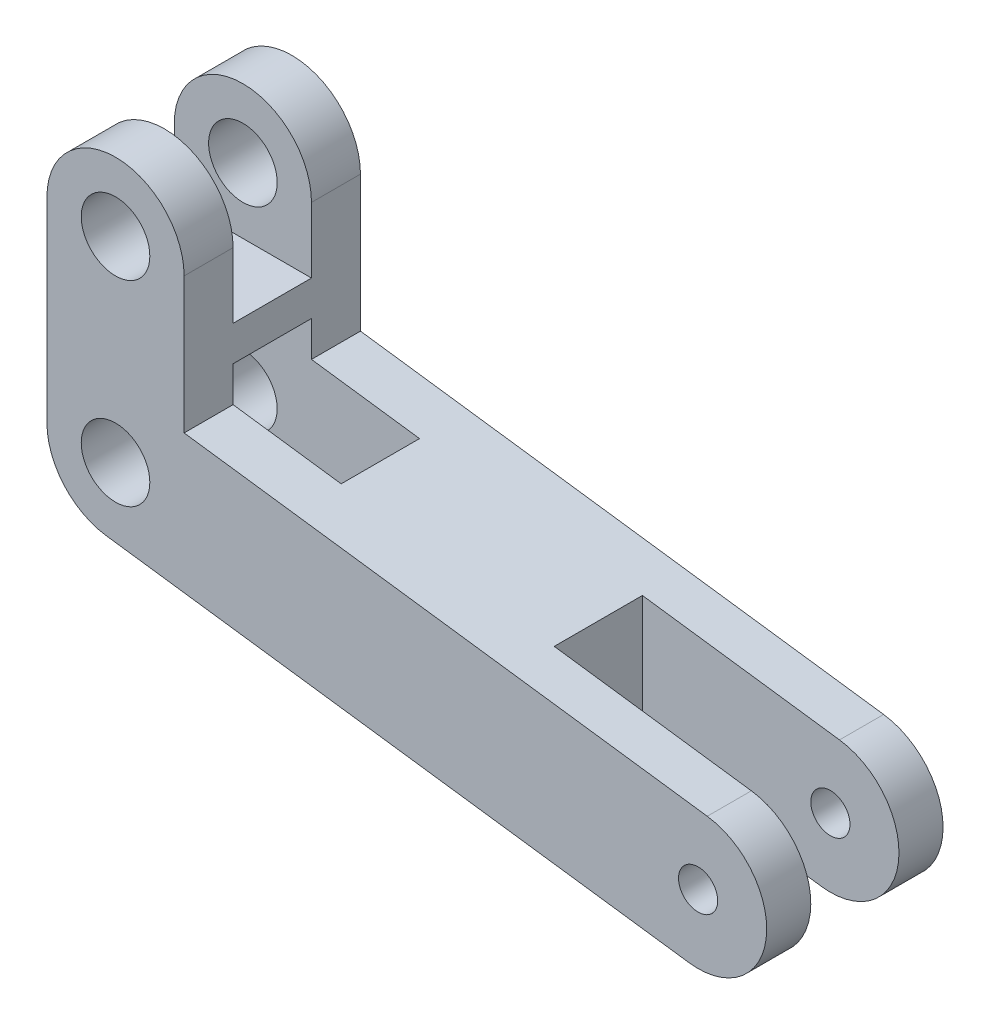
ISO-10303-21;
HEADER;
FILE_DESCRIPTION(('STEP AP214'),'2;1');
FILE_NAME('part.step','',(''),(''),'','','');
FILE_SCHEMA(('AUTOMOTIVE_DESIGN { 1 0 10303 214 1 1 1 1 }'));
ENDSEC;
DATA;
#1=APPLICATION_CONTEXT('core data for automotive mechanical design processes');
#2=APPLICATION_PROTOCOL_DEFINITION('international standard','automotive_design',2000,#1);
#3=PRODUCT_CONTEXT('',#1,'mechanical');
#4=PRODUCT('Part','Part','',(#3));
#5=PRODUCT_RELATED_PRODUCT_CATEGORY('part','',(#4));
#6=PRODUCT_DEFINITION_FORMATION('','',#4);
#7=PRODUCT_DEFINITION_CONTEXT('part definition',#1,'design');
#8=PRODUCT_DEFINITION('design','',#6,#7);
#9=PRODUCT_DEFINITION_SHAPE('','',#8);
#10=(LENGTH_UNIT() NAMED_UNIT(*) SI_UNIT(.MILLI.,.METRE.));
#11=(NAMED_UNIT(*) PLANE_ANGLE_UNIT() SI_UNIT($,.RADIAN.));
#12=(NAMED_UNIT(*) SI_UNIT($,.STERADIAN.) SOLID_ANGLE_UNIT());
#13=UNCERTAINTY_MEASURE_WITH_UNIT(LENGTH_MEASURE(1.E-05),#10,'distance_accuracy_value','');
#14=(GEOMETRIC_REPRESENTATION_CONTEXT(3) GLOBAL_UNCERTAINTY_ASSIGNED_CONTEXT((#13)) GLOBAL_UNIT_ASSIGNED_CONTEXT((#10,
#11,#12)) REPRESENTATION_CONTEXT('',''));
#15=CARTESIAN_POINT('',(0.,0.,0.));
#16=DIRECTION('',(0.,0.,1.));
#17=DIRECTION('',(1.,0.,0.));
#18=AXIS2_PLACEMENT_3D('',#15,#16,#17);
#19=CARTESIAN_POINT('',(29.732137494637,-4.,4.5));
#20=DIRECTION('',(0.,0.,-1.));
#21=DIRECTION('',(-1.,0.,0.));
#22=AXIS2_PLACEMENT_3D('',#19,#20,#21);
#23=CYLINDRICAL_SURFACE('',#22,3.5);
#24=CARTESIAN_POINT('',(29.732137494637,-4.,-2.25));
#25=DIRECTION('',(0.,0.,1.));
#26=DIRECTION('',(1.,0.,0.));
#27=AXIS2_PLACEMENT_3D('',#24,#25,#26);
#28=CIRCLE('',#27,3.5);
#29=CARTESIAN_POINT('',(29.2654708279703,-7.46874937437432,-2.25));
#30=VERTEX_POINT('',#29);
#31=CARTESIAN_POINT('',(30.1988041613037,-0.53125062562568,-2.25));
#32=VERTEX_POINT('',#31);
#33=EDGE_CURVE('E219',#30,#32,#28,.T.);
#34=ORIENTED_EDGE('',*,*,#33,.F.);
#35=DIRECTION('',(0.,0.,-1.));
#36=VECTOR('',#35,1.);
#37=CARTESIAN_POINT('',(29.2654708279703,-7.46874937437432,4.5));
#38=LINE('',#37,#36);
#39=CARTESIAN_POINT('',(29.2654708279703,-7.46874937437432,-4.5));
#40=VERTEX_POINT('',#39);
#41=EDGE_CURVE('E323',#30,#40,#38,.T.);
#42=ORIENTED_EDGE('',*,*,#41,.T.);
#43=CARTESIAN_POINT('',(29.732137494637,-4.,-4.5));
#44=DIRECTION('',(0.,0.,1.));
#45=DIRECTION('',(1.,0.,0.));
#46=AXIS2_PLACEMENT_3D('',#43,#44,#45);
#47=CIRCLE('',#46,3.5);
#48=CARTESIAN_POINT('',(30.1988041613037,-0.531250625625681,-4.5));
#49=VERTEX_POINT('',#48);
#50=EDGE_CURVE('E304',#40,#49,#47,.T.);
#51=ORIENTED_EDGE('',*,*,#50,.T.);
#52=DIRECTION('',(0.,0.,-1.));
#53=VECTOR('',#52,1.);
#54=CARTESIAN_POINT('',(30.1988041613037,-0.531250625625681,4.5));
#55=LINE('',#54,#53);
#56=EDGE_CURVE('E366',#32,#49,#55,.T.);
#57=ORIENTED_EDGE('',*,*,#56,.F.);
#58=EDGE_LOOP('',(#34,#42,#51,#57));
#59=FACE_BOUND('',#58,.T.);
#60=ADVANCED_FACE('F41',(#59),#23,.T.);
#61=CARTESIAN_POINT('',(30.1988041613037,-0.531250625625681,4.5));
#62=DIRECTION('',(-0.133333333333333,-0.991071249821234,0.));
#63=DIRECTION('',(0.991071249821234,-0.133333333333333,0.));
#64=AXIS2_PLACEMENT_3D('',#61,#62,#63);
#65=PLANE('',#64);
#66=DIRECTION('',(-0.991071249821234,0.133333333333333,0.));
#67=VECTOR('',#66,1.);
#68=CARTESIAN_POINT('',(30.1988041613037,-0.531250625625681,-2.25));
#69=LINE('',#68,#67);
#70=CARTESIAN_POINT('',(20.1387282375716,0.822177250260696,-2.25));
#71=VERTEX_POINT('',#70);
#72=EDGE_CURVE('E201',#32,#71,#69,.T.);
#73=ORIENTED_EDGE('',*,*,#72,.F.);
#74=ORIENTED_EDGE('',*,*,#56,.T.);
#75=DIRECTION('',(-0.991071249821234,0.133333333333333,0.));
#76=VECTOR('',#75,1.);
#77=CARTESIAN_POINT('',(30.1988041613037,-0.531250625625681,-4.5));
#78=LINE('',#77,#76);
#79=CARTESIAN_POINT('',(3.5,3.06066121268322,-4.5));
#80=VERTEX_POINT('',#79);
#81=EDGE_CURVE('E326',#49,#80,#78,.T.);
#82=ORIENTED_EDGE('',*,*,#81,.T.);
#83=DIRECTION('',(0.,0.,-1.));
#84=VECTOR('',#83,1.);
#85=CARTESIAN_POINT('',(3.5,3.06066121268322,4.5));
#86=LINE('',#85,#84);
#87=CARTESIAN_POINT('',(3.5,3.06066121268322,-2.));
#88=VERTEX_POINT('',#87);
#89=EDGE_CURVE('E362',#88,#80,#86,.T.);
#90=ORIENTED_EDGE('',*,*,#89,.F.);
#91=DIRECTION('',(0.991071249821234,-0.133333333333333,0.));
#92=VECTOR('',#91,1.);
#93=CARTESIAN_POINT('',(30.1988041613037,-0.531250625625681,-2.));
#94=LINE('',#93,#92);
#95=CARTESIAN_POINT('',(9.01483292771079,2.31872559790201,-2.));
#96=VERTEX_POINT('',#95);
#97=EDGE_CURVE('E279',#88,#96,#94,.T.);
#98=ORIENTED_EDGE('',*,*,#97,.T.);
#99=DIRECTION('',(0.,0.,1.));
#100=VECTOR('',#99,1.);
#101=CARTESIAN_POINT('',(9.01483292771079,2.31872559790201,4.5));
#102=LINE('',#101,#100);
#103=CARTESIAN_POINT('',(9.01483292771079,2.31872559790201,2.));
#104=VERTEX_POINT('',#103);
#105=EDGE_CURVE('E282',#96,#104,#102,.T.);
#106=ORIENTED_EDGE('',*,*,#105,.T.);
#107=DIRECTION('',(0.991071249821234,-0.133333333333333,0.));
#108=VECTOR('',#107,1.);
#109=CARTESIAN_POINT('',(30.1988041613037,-0.531250625625681,2.));
#110=LINE('',#109,#108);
#111=CARTESIAN_POINT('',(3.5,3.06066121268322,2.));
#112=VERTEX_POINT('',#111);
#113=EDGE_CURVE('E264',#112,#104,#110,.T.);
#114=ORIENTED_EDGE('',*,*,#113,.F.);
#115=CARTESIAN_POINT('',(3.5,3.06066121268322,4.5));
#116=VERTEX_POINT('',#115);
#117=EDGE_CURVE('E363',#116,#112,#86,.T.);
#118=ORIENTED_EDGE('',*,*,#117,.F.);
#119=DIRECTION('',(-0.991071249821234,0.133333333333333,0.));
#120=VECTOR('',#119,1.);
#121=CARTESIAN_POINT('',(30.1988041613037,-0.531250625625681,4.5));
#122=LINE('',#121,#120);
#123=CARTESIAN_POINT('',(30.1988041613037,-0.531250625625681,4.5));
#124=VERTEX_POINT('',#123);
#125=EDGE_CURVE('E310',#124,#116,#122,.T.);
#126=ORIENTED_EDGE('',*,*,#125,.F.);
#127=CARTESIAN_POINT('',(30.1988041613037,-0.53125062562568,2.25));
#128=VERTEX_POINT('',#127);
#129=EDGE_CURVE('E210',#124,#128,#55,.T.);
#130=ORIENTED_EDGE('',*,*,#129,.T.);
#131=DIRECTION('',(-0.991071249821234,0.133333333333333,0.));
#132=VECTOR('',#131,1.);
#133=CARTESIAN_POINT('',(30.1988041613037,-0.531250625625681,2.25));
#134=LINE('',#133,#132);
#135=CARTESIAN_POINT('',(20.1387282375716,0.822177250260696,2.25));
#136=VERTEX_POINT('',#135);
#137=EDGE_CURVE('E204',#128,#136,#134,.T.);
#138=ORIENTED_EDGE('',*,*,#137,.T.);
#139=DIRECTION('',(0.,0.,-1.));
#140=VECTOR('',#139,1.);
#141=CARTESIAN_POINT('',(20.1387282375716,0.822177250260698,4.5));
#142=LINE('',#141,#140);
#143=EDGE_CURVE('E191',#136,#71,#142,.T.);
#144=ORIENTED_EDGE('',*,*,#143,.T.);
#145=EDGE_LOOP('',(#73,#74,#82,#90,#98,#106,#114,#118,#126,#130,#138,#144));
#146=FACE_BOUND('',#145,.T.);
#147=ADVANCED_FACE('F208',(#146),#65,.F.);
#148=CARTESIAN_POINT('',(29.2654708279703,-7.46874937437432,4.5));
#149=DIRECTION('',(0.133333333333333,0.991071249821234,0.));
#150=DIRECTION('',(-0.991071249821234,0.133333333333333,0.));
#151=AXIS2_PLACEMENT_3D('',#148,#149,#150);
#152=PLANE('',#151);
#153=DIRECTION('',(0.991071249821234,-0.133333333333333,0.));
#154=VECTOR('',#153,1.);
#155=CARTESIAN_POINT('',(29.2654708279703,-7.46874937437432,-2.25));
#156=LINE('',#155,#154);
#157=CARTESIAN_POINT('',(20.1387282375716,-6.24088708670059,-2.25));
#158=VERTEX_POINT('',#157);
#159=EDGE_CURVE('E214',#158,#30,#156,.T.);
#160=ORIENTED_EDGE('',*,*,#159,.F.);
#161=DIRECTION('',(0.,0.,1.));
#162=VECTOR('',#161,1.);
#163=CARTESIAN_POINT('',(20.1387282375716,-6.24088708670059,4.5));
#164=LINE('',#163,#162);
#165=CARTESIAN_POINT('',(20.1387282375716,-6.24088708670059,2.25));
#166=VERTEX_POINT('',#165);
#167=EDGE_CURVE('E11',#158,#166,#164,.T.);
#168=ORIENTED_EDGE('',*,*,#167,.T.);
#169=DIRECTION('',(0.991071249821234,-0.133333333333333,0.));
#170=VECTOR('',#169,1.);
#171=CARTESIAN_POINT('',(29.2654708279703,-7.46874937437432,2.25));
#172=LINE('',#171,#170);
#173=CARTESIAN_POINT('',(29.2654708279703,-7.46874937437432,2.25));
#174=VERTEX_POINT('',#173);
#175=EDGE_CURVE('E205',#166,#174,#172,.T.);
#176=ORIENTED_EDGE('',*,*,#175,.T.);
#177=CARTESIAN_POINT('',(29.2654708279703,-7.46874937437432,4.5));
#178=VERTEX_POINT('',#177);
#179=EDGE_CURVE('E343',#178,#174,#38,.T.);
#180=ORIENTED_EDGE('',*,*,#179,.F.);
#181=DIRECTION('',(0.991071249821234,-0.133333333333333,0.));
#182=VECTOR('',#181,1.);
#183=CARTESIAN_POINT('',(29.2654708279703,-7.46874937437432,4.5));
#184=LINE('',#183,#182);
#185=CARTESIAN_POINT('',(-0.466666666666667,-3.46874937437432,4.5));
#186=VERTEX_POINT('',#185);
#187=EDGE_CURVE('E321',#186,#178,#184,.T.);
#188=ORIENTED_EDGE('',*,*,#187,.F.);
#189=DIRECTION('',(0.,0.,-1.));
#190=VECTOR('',#189,1.);
#191=CARTESIAN_POINT('',(-0.466666666666667,-3.46874937437432,4.5));
#192=LINE('',#191,#190);
#193=CARTESIAN_POINT('',(-0.466666666666664,-3.46874937437432,2.));
#194=VERTEX_POINT('',#193);
#195=EDGE_CURVE('E347',#186,#194,#192,.T.);
#196=ORIENTED_EDGE('',*,*,#195,.T.);
#197=DIRECTION('',(-0.991071249821234,0.133333333333333,0.));
#198=VECTOR('',#197,1.);
#199=CARTESIAN_POINT('',(29.2654708279703,-7.46874937437432,2.));
#200=LINE('',#199,#198);
#201=CARTESIAN_POINT('',(9.01483292771079,-4.74433873905928,2.));
#202=VERTEX_POINT('',#201);
#203=EDGE_CURVE('E256',#202,#194,#200,.T.);
#204=ORIENTED_EDGE('',*,*,#203,.F.);
#205=DIRECTION('',(0.,0.,-1.));
#206=VECTOR('',#205,1.);
#207=CARTESIAN_POINT('',(9.01483292771079,-4.74433873905928,4.5));
#208=LINE('',#207,#206);
#209=CARTESIAN_POINT('',(9.01483292771079,-4.74433873905928,-2.));
#210=VERTEX_POINT('',#209);
#211=EDGE_CURVE('E368',#202,#210,#208,.T.);
#212=ORIENTED_EDGE('',*,*,#211,.T.);
#213=DIRECTION('',(-0.991071249821234,0.133333333333333,0.));
#214=VECTOR('',#213,1.);
#215=CARTESIAN_POINT('',(29.2654708279703,-7.46874937437432,-2.));
#216=LINE('',#215,#214);
#217=CARTESIAN_POINT('',(-0.466666666666664,-3.46874937437432,-2.));
#218=VERTEX_POINT('',#217);
#219=EDGE_CURVE('E267',#210,#218,#216,.T.);
#220=ORIENTED_EDGE('',*,*,#219,.T.);
#221=CARTESIAN_POINT('',(-0.466666666666667,-3.46874937437432,-4.5));
#222=VERTEX_POINT('',#221);
#223=EDGE_CURVE('E346',#218,#222,#192,.T.);
#224=ORIENTED_EDGE('',*,*,#223,.T.);
#225=DIRECTION('',(0.991071249821234,-0.133333333333333,0.));
#226=VECTOR('',#225,1.);
#227=CARTESIAN_POINT('',(29.2654708279703,-7.46874937437432,-4.5));
#228=LINE('',#227,#226);
#229=EDGE_CURVE('E311',#222,#40,#228,.T.);
#230=ORIENTED_EDGE('',*,*,#229,.T.);
#231=ORIENTED_EDGE('',*,*,#41,.F.);
#232=EDGE_LOOP('',(#160,#168,#176,#180,#188,#196,#204,#212,#220,#224,#230,#231));
#233=FACE_BOUND('',#232,.T.);
#234=ADVANCED_FACE('F395',(#233),#152,.F.);
#235=CARTESIAN_POINT('',(29.732137494637,-4.,4.5));
#236=DIRECTION('',(0.,0.,-1.));
#237=DIRECTION('',(-1.,0.,0.));
#238=AXIS2_PLACEMENT_3D('',#235,#236,#237);
#239=CYLINDRICAL_SURFACE('',#238,0.999999999999998);
#240=CARTESIAN_POINT('',(29.732137494637,-4.,-4.5));
#241=DIRECTION('',(0.,0.,1.));
#242=DIRECTION('',(1.,0.,0.));
#243=AXIS2_PLACEMENT_3D('',#240,#241,#242);
#244=CIRCLE('',#243,0.999999999999998);
#245=CARTESIAN_POINT('',(30.732137494637,-4.,-4.5));
#246=VERTEX_POINT('',#245);
#247=EDGE_CURVE('E292',#246,#246,#244,.T.);
#248=ORIENTED_EDGE('',*,*,#247,.F.);
#249=EDGE_LOOP('',(#248));
#250=FACE_BOUND('',#249,.T.);
#251=CARTESIAN_POINT('',(29.732137494637,-4.,-2.25));
#252=DIRECTION('',(0.,0.,1.));
#253=DIRECTION('',(1.,0.,0.));
#254=AXIS2_PLACEMENT_3D('',#251,#252,#253);
#255=CIRCLE('',#254,0.999999999999998);
#256=CARTESIAN_POINT('',(30.732137494637,-4.,-2.25));
#257=VERTEX_POINT('',#256);
#258=EDGE_CURVE('E211',#257,#257,#255,.T.);
#259=ORIENTED_EDGE('',*,*,#258,.T.);
#260=EDGE_LOOP('',(#259));
#261=FACE_BOUND('',#260,.T.);
#262=ADVANCED_FACE('F470',(#250,#261),#239,.F.);
#263=CARTESIAN_POINT('',(3.5,10.,4.5));
#264=DIRECTION('',(-1.,0.,0.));
#265=DIRECTION('',(0.,-1.,0.));
#266=AXIS2_PLACEMENT_3D('',#263,#264,#265);
#267=PLANE('',#266);
#268=DIRECTION('',(0.,1.,0.));
#269=VECTOR('',#268,1.);
#270=CARTESIAN_POINT('',(3.5,16.4698635435501,-2.));
#271=LINE('',#270,#269);
#272=CARTESIAN_POINT('',(3.5,6.65669603838257,-2.));
#273=VERTEX_POINT('',#272);
#274=CARTESIAN_POINT('',(3.5,10.,-2.));
#275=VERTEX_POINT('',#274);
#276=EDGE_CURVE('E224',#273,#275,#271,.T.);
#277=ORIENTED_EDGE('',*,*,#276,.F.);
#278=DIRECTION('',(0.,0.,1.));
#279=VECTOR('',#278,1.);
#280=CARTESIAN_POINT('',(3.5,6.65669603838257,-2.));
#281=LINE('',#280,#279);
#282=CARTESIAN_POINT('',(3.5,6.65669603838257,2.));
#283=VERTEX_POINT('',#282);
#284=EDGE_CURVE('E227',#273,#283,#281,.T.);
#285=ORIENTED_EDGE('',*,*,#284,.T.);
#286=DIRECTION('',(0.,1.,0.));
#287=VECTOR('',#286,1.);
#288=CARTESIAN_POINT('',(3.5,16.4698635435501,2.));
#289=LINE('',#288,#287);
#290=CARTESIAN_POINT('',(3.5,10.,2.));
#291=VERTEX_POINT('',#290);
#292=EDGE_CURVE('E225',#283,#291,#289,.T.);
#293=ORIENTED_EDGE('',*,*,#292,.T.);
#294=DIRECTION('',(0.,0.,-1.));
#295=VECTOR('',#294,1.);
#296=CARTESIAN_POINT('',(3.5,10.,4.5));
#297=LINE('',#296,#295);
#298=CARTESIAN_POINT('',(3.5,10.,4.5));
#299=VERTEX_POINT('',#298);
#300=EDGE_CURVE('E359',#299,#291,#297,.T.);
#301=ORIENTED_EDGE('',*,*,#300,.F.);
#302=DIRECTION('',(0.,1.,0.));
#303=VECTOR('',#302,1.);
#304=CARTESIAN_POINT('',(3.5,10.,4.5));
#305=LINE('',#304,#303);
#306=EDGE_CURVE('E313',#116,#299,#305,.T.);
#307=ORIENTED_EDGE('',*,*,#306,.F.);
#308=ORIENTED_EDGE('',*,*,#117,.T.);
#309=DIRECTION('',(0.,-1.,0.));
#310=VECTOR('',#309,1.);
#311=CARTESIAN_POINT('',(3.5,10.,2.));
#312=LINE('',#311,#310);
#313=CARTESIAN_POINT('',(3.5,4.86934920884361,2.));
#314=VERTEX_POINT('',#313);
#315=EDGE_CURVE('E262',#314,#112,#312,.T.);
#316=ORIENTED_EDGE('',*,*,#315,.F.);
#317=DIRECTION('',(0.,0.,-1.));
#318=VECTOR('',#317,1.);
#319=CARTESIAN_POINT('',(3.5,4.86934920884361,4.5));
#320=LINE('',#319,#318);
#321=CARTESIAN_POINT('',(3.5,4.86934920884361,-2.));
#322=VERTEX_POINT('',#321);
#323=EDGE_CURVE('E285',#314,#322,#320,.T.);
#324=ORIENTED_EDGE('',*,*,#323,.T.);
#325=DIRECTION('',(0.,-1.,0.));
#326=VECTOR('',#325,1.);
#327=CARTESIAN_POINT('',(3.5,10.,-2.));
#328=LINE('',#327,#326);
#329=EDGE_CURVE('E276',#322,#88,#328,.T.);
#330=ORIENTED_EDGE('',*,*,#329,.T.);
#331=ORIENTED_EDGE('',*,*,#89,.T.);
#332=DIRECTION('',(0.,1.,0.));
#333=VECTOR('',#332,1.);
#334=CARTESIAN_POINT('',(3.5,10.,-4.5));
#335=LINE('',#334,#333);
#336=CARTESIAN_POINT('',(3.5,10.,-4.5));
#337=VERTEX_POINT('',#336);
#338=EDGE_CURVE('E329',#80,#337,#335,.T.);
#339=ORIENTED_EDGE('',*,*,#338,.T.);
#340=EDGE_CURVE('E358',#275,#337,#297,.T.);
#341=ORIENTED_EDGE('',*,*,#340,.F.);
#342=EDGE_LOOP('',(#277,#285,#293,#301,#307,#308,#316,#324,#330,#331,#339,#341));
#343=FACE_BOUND('',#342,.T.);
#344=ADVANCED_FACE('F411',(#343),#267,.F.);
#345=CARTESIAN_POINT('',(0.,10.,4.5));
#346=DIRECTION('',(0.,0.,-1.));
#347=DIRECTION('',(-1.,0.,0.));
#348=AXIS2_PLACEMENT_3D('',#345,#346,#347);
#349=CYLINDRICAL_SURFACE('',#348,3.5);
#350=CARTESIAN_POINT('',(0.,10.,-2.));
#351=DIRECTION('',(0.,0.,1.));
#352=DIRECTION('',(1.,0.,0.));
#353=AXIS2_PLACEMENT_3D('',#350,#351,#352);
#354=CIRCLE('',#353,3.5);
#355=CARTESIAN_POINT('',(-3.5,10.,-2.));
#356=VERTEX_POINT('',#355);
#357=EDGE_CURVE('E253',#275,#356,#354,.T.);
#358=ORIENTED_EDGE('',*,*,#357,.F.);
#359=ORIENTED_EDGE('',*,*,#340,.T.);
#360=CARTESIAN_POINT('',(0.,10.,-4.5));
#361=DIRECTION('',(0.,0.,1.));
#362=DIRECTION('',(1.,0.,0.));
#363=AXIS2_PLACEMENT_3D('',#360,#361,#362);
#364=CIRCLE('',#363,3.5);
#365=CARTESIAN_POINT('',(-3.5,10.,-4.5));
#366=VERTEX_POINT('',#365);
#367=EDGE_CURVE('E332',#337,#366,#364,.T.);
#368=ORIENTED_EDGE('',*,*,#367,.T.);
#369=DIRECTION('',(0.,0.,-1.));
#370=VECTOR('',#369,1.);
#371=CARTESIAN_POINT('',(-3.5,10.,4.5));
#372=LINE('',#371,#370);
#373=EDGE_CURVE('E354',#356,#366,#372,.T.);
#374=ORIENTED_EDGE('',*,*,#373,.F.);
#375=EDGE_LOOP('',(#358,#359,#368,#374));
#376=FACE_BOUND('',#375,.T.);
#377=ADVANCED_FACE('F459',(#376),#349,.T.);
#378=CARTESIAN_POINT('',(-3.5,10.,4.5));
#379=DIRECTION('',(1.,0.,0.));
#380=DIRECTION('',(0.,1.,0.));
#381=AXIS2_PLACEMENT_3D('',#378,#379,#380);
#382=PLANE('',#381);
#383=DIRECTION('',(0.,-1.,0.));
#384=VECTOR('',#383,1.);
#385=CARTESIAN_POINT('',(-3.5,10.,-2.));
#386=LINE('',#385,#384);
#387=CARTESIAN_POINT('',(-3.5,6.65669603838257,-2.));
#388=VERTEX_POINT('',#387);
#389=EDGE_CURVE('E251',#356,#388,#386,.T.);
#390=ORIENTED_EDGE('',*,*,#389,.F.);
#391=ORIENTED_EDGE('',*,*,#373,.T.);
#392=DIRECTION('',(0.,-1.,0.));
#393=VECTOR('',#392,1.);
#394=CARTESIAN_POINT('',(-3.5,10.,-4.5));
#395=LINE('',#394,#393);
#396=CARTESIAN_POINT('',(-3.5,0.,-4.5));
#397=VERTEX_POINT('',#396);
#398=EDGE_CURVE('E335',#366,#397,#395,.T.);
#399=ORIENTED_EDGE('',*,*,#398,.T.);
#400=DIRECTION('',(0.,0.,-1.));
#401=VECTOR('',#400,1.);
#402=CARTESIAN_POINT('',(-3.5,0.,4.5));
#403=LINE('',#402,#401);
#404=CARTESIAN_POINT('',(-3.5,0.,-2.));
#405=VERTEX_POINT('',#404);
#406=EDGE_CURVE('E350',#405,#397,#403,.T.);
#407=ORIENTED_EDGE('',*,*,#406,.F.);
#408=DIRECTION('',(0.,1.,0.));
#409=VECTOR('',#408,1.);
#410=CARTESIAN_POINT('',(-3.5,10.,-2.));
#411=LINE('',#410,#409);
#412=CARTESIAN_POINT('',(-3.5,4.86934920884361,-2.));
#413=VERTEX_POINT('',#412);
#414=EDGE_CURVE('E273',#405,#413,#411,.T.);
#415=ORIENTED_EDGE('',*,*,#414,.T.);
#416=DIRECTION('',(0.,0.,1.));
#417=VECTOR('',#416,1.);
#418=CARTESIAN_POINT('',(-3.5,4.86934920884361,4.5));
#419=LINE('',#418,#417);
#420=CARTESIAN_POINT('',(-3.5,4.86934920884361,2.));
#421=VERTEX_POINT('',#420);
#422=EDGE_CURVE('E379',#413,#421,#419,.T.);
#423=ORIENTED_EDGE('',*,*,#422,.T.);
#424=DIRECTION('',(0.,1.,0.));
#425=VECTOR('',#424,1.);
#426=CARTESIAN_POINT('',(-3.5,10.,2.));
#427=LINE('',#426,#425);
#428=CARTESIAN_POINT('',(-3.5,0.,2.));
#429=VERTEX_POINT('',#428);
#430=EDGE_CURVE('E260',#429,#421,#427,.T.);
#431=ORIENTED_EDGE('',*,*,#430,.F.);
#432=CARTESIAN_POINT('',(-3.5,0.,4.5));
#433=VERTEX_POINT('',#432);
#434=EDGE_CURVE('E351',#433,#429,#403,.T.);
#435=ORIENTED_EDGE('',*,*,#434,.F.);
#436=DIRECTION('',(0.,-1.,0.));
#437=VECTOR('',#436,1.);
#438=CARTESIAN_POINT('',(-3.5,10.,4.5));
#439=LINE('',#438,#437);
#440=CARTESIAN_POINT('',(-3.5,10.,4.5));
#441=VERTEX_POINT('',#440);
#442=EDGE_CURVE('E317',#441,#433,#439,.T.);
#443=ORIENTED_EDGE('',*,*,#442,.F.);
#444=CARTESIAN_POINT('',(-3.5,10.,2.));
#445=VERTEX_POINT('',#444);
#446=EDGE_CURVE('E355',#441,#445,#372,.T.);
#447=ORIENTED_EDGE('',*,*,#446,.T.);
#448=DIRECTION('',(0.,-1.,0.));
#449=VECTOR('',#448,1.);
#450=CARTESIAN_POINT('',(-3.5,10.,2.));
#451=LINE('',#450,#449);
#452=CARTESIAN_POINT('',(-3.5,6.65669603838257,2.));
#453=VERTEX_POINT('',#452);
#454=EDGE_CURVE('E244',#445,#453,#451,.T.);
#455=ORIENTED_EDGE('',*,*,#454,.T.);
#456=DIRECTION('',(0.,0.,-1.));
#457=VECTOR('',#456,1.);
#458=CARTESIAN_POINT('',(-3.5,6.65669603838257,4.5));
#459=LINE('',#458,#457);
#460=EDGE_CURVE('E49',#453,#388,#459,.T.);
#461=ORIENTED_EDGE('',*,*,#460,.T.);
#462=EDGE_LOOP('',(#390,#391,#399,#407,#415,#423,#431,#435,#443,#447,#455,#461));
#463=FACE_BOUND('',#462,.T.);
#464=ADVANCED_FACE('F434',(#463),#382,.F.);
#465=CARTESIAN_POINT('',(0.,0.,4.5));
#466=DIRECTION('',(0.,0.,-1.));
#467=DIRECTION('',(-1.,0.,0.));
#468=AXIS2_PLACEMENT_3D('',#465,#466,#467);
#469=CYLINDRICAL_SURFACE('',#468,3.5);
#470=CARTESIAN_POINT('',(0.,0.,2.));
#471=DIRECTION('',(0.,0.,-1.));
#472=DIRECTION('',(-1.,0.,0.));
#473=AXIS2_PLACEMENT_3D('',#470,#471,#472);
#474=CIRCLE('',#473,3.5);
#475=EDGE_CURVE('E258',#194,#429,#474,.T.);
#476=ORIENTED_EDGE('',*,*,#475,.F.);
#477=ORIENTED_EDGE('',*,*,#195,.F.);
#478=CARTESIAN_POINT('',(0.,0.,4.5));
#479=DIRECTION('',(0.,0.,1.));
#480=DIRECTION('',(1.,0.,0.));
#481=AXIS2_PLACEMENT_3D('',#478,#479,#480);
#482=CIRCLE('',#481,3.5);
#483=EDGE_CURVE('E319',#433,#186,#482,.T.);
#484=ORIENTED_EDGE('',*,*,#483,.F.);
#485=ORIENTED_EDGE('',*,*,#434,.T.);
#486=EDGE_LOOP('',(#476,#477,#484,#485));
#487=FACE_BOUND('',#486,.T.);
#488=ADVANCED_FACE('F428',(#487),#469,.T.);
#489=CARTESIAN_POINT('',(0.,0.,4.5));
#490=DIRECTION('',(0.,0.,-1.));
#491=DIRECTION('',(-1.,0.,0.));
#492=AXIS2_PLACEMENT_3D('',#489,#490,#491);
#493=CYLINDRICAL_SURFACE('',#492,1.75);
#494=CARTESIAN_POINT('',(0.,0.,4.5));
#495=DIRECTION('',(0.,0.,1.));
#496=DIRECTION('',(1.,0.,0.));
#497=AXIS2_PLACEMENT_3D('',#494,#495,#496);
#498=CIRCLE('',#497,1.75);
#499=CARTESIAN_POINT('',(1.75,0.,4.5));
#500=VERTEX_POINT('',#499);
#501=EDGE_CURVE('E301',#500,#500,#498,.T.);
#502=ORIENTED_EDGE('',*,*,#501,.T.);
#503=EDGE_LOOP('',(#502));
#504=FACE_BOUND('',#503,.T.);
#505=CARTESIAN_POINT('',(0.,0.,2.));
#506=DIRECTION('',(0.,0.,-1.));
#507=DIRECTION('',(-1.,0.,0.));
#508=AXIS2_PLACEMENT_3D('',#505,#506,#507);
#509=CIRCLE('',#508,1.75);
#510=CARTESIAN_POINT('',(-1.75,0.,2.));
#511=VERTEX_POINT('',#510);
#512=EDGE_CURVE('E255',#511,#511,#509,.T.);
#513=ORIENTED_EDGE('',*,*,#512,.T.);
#514=EDGE_LOOP('',(#513));
#515=FACE_BOUND('',#514,.T.);
#516=ADVANCED_FACE('F489',(#504,#515),#493,.F.);
#517=CARTESIAN_POINT('',(0.,10.,4.5));
#518=DIRECTION('',(0.,0.,-1.));
#519=DIRECTION('',(-1.,0.,0.));
#520=AXIS2_PLACEMENT_3D('',#517,#518,#519);
#521=CYLINDRICAL_SURFACE('',#520,1.75);
#522=CARTESIAN_POINT('',(0.,10.,-4.5));
#523=DIRECTION('',(0.,0.,1.));
#524=DIRECTION('',(1.,0.,0.));
#525=AXIS2_PLACEMENT_3D('',#522,#523,#524);
#526=CIRCLE('',#525,1.75);
#527=CARTESIAN_POINT('',(1.75,10.,-4.5));
#528=VERTEX_POINT('',#527);
#529=EDGE_CURVE('E288',#528,#528,#526,.T.);
#530=ORIENTED_EDGE('',*,*,#529,.F.);
#531=EDGE_LOOP('',(#530));
#532=FACE_BOUND('',#531,.T.);
#533=CARTESIAN_POINT('',(0.,10.,-2.));
#534=DIRECTION('',(0.,0.,1.));
#535=DIRECTION('',(1.,0.,0.));
#536=AXIS2_PLACEMENT_3D('',#533,#534,#535);
#537=CIRCLE('',#536,1.75);
#538=CARTESIAN_POINT('',(1.75,10.,-2.));
#539=VERTEX_POINT('',#538);
#540=EDGE_CURVE('E250',#539,#539,#537,.T.);
#541=ORIENTED_EDGE('',*,*,#540,.T.);
#542=EDGE_LOOP('',(#541));
#543=FACE_BOUND('',#542,.T.);
#544=ADVANCED_FACE('F483',(#532,#543),#521,.F.);
#545=CARTESIAN_POINT('',(29.732137494637,-4.,4.5));
#546=DIRECTION('',(0.,0.,1.));
#547=DIRECTION('',(1.,0.,0.));
#548=AXIS2_PLACEMENT_3D('',#545,#546,#547);
#549=PLANE('',#548);
#550=CARTESIAN_POINT('',(29.732137494637,-4.,4.5));
#551=DIRECTION('',(0.,0.,1.));
#552=DIRECTION('',(1.,0.,0.));
#553=AXIS2_PLACEMENT_3D('',#550,#551,#552);
#554=CIRCLE('',#553,0.999999999999998);
#555=CARTESIAN_POINT('',(30.732137494637,-4.,4.5));
#556=VERTEX_POINT('',#555);
#557=EDGE_CURVE('E295',#556,#556,#554,.T.);
#558=ORIENTED_EDGE('',*,*,#557,.F.);
#559=EDGE_LOOP('',(#558));
#560=FACE_BOUND('',#559,.T.);
#561=CARTESIAN_POINT('',(29.732137494637,-4.,4.5));
#562=DIRECTION('',(0.,0.,1.));
#563=DIRECTION('',(1.,0.,0.));
#564=AXIS2_PLACEMENT_3D('',#561,#562,#563);
#565=CIRCLE('',#564,3.5);
#566=EDGE_CURVE('E307',#178,#124,#565,.T.);
#567=ORIENTED_EDGE('',*,*,#566,.T.);
#568=ORIENTED_EDGE('',*,*,#125,.T.);
#569=ORIENTED_EDGE('',*,*,#306,.T.);
#570=CARTESIAN_POINT('',(0.,10.,4.5));
#571=DIRECTION('',(0.,0.,1.));
#572=DIRECTION('',(1.,0.,0.));
#573=AXIS2_PLACEMENT_3D('',#570,#571,#572);
#574=CIRCLE('',#573,3.5);
#575=EDGE_CURVE('E315',#299,#441,#574,.T.);
#576=ORIENTED_EDGE('',*,*,#575,.T.);
#577=ORIENTED_EDGE('',*,*,#442,.T.);
#578=ORIENTED_EDGE('',*,*,#483,.T.);
#579=ORIENTED_EDGE('',*,*,#187,.T.);
#580=EDGE_LOOP('',(#567,#568,#569,#576,#577,#578,#579));
#581=FACE_BOUND('',#580,.T.);
#582=ORIENTED_EDGE('',*,*,#501,.F.);
#583=EDGE_LOOP('',(#582));
#584=FACE_BOUND('',#583,.T.);
#585=CARTESIAN_POINT('',(0.,10.,4.5));
#586=DIRECTION('',(0.,0.,1.));
#587=DIRECTION('',(1.,0.,0.));
#588=AXIS2_PLACEMENT_3D('',#585,#586,#587);
#589=CIRCLE('',#588,1.75);
#590=CARTESIAN_POINT('',(1.75,10.,4.5));
#591=VERTEX_POINT('',#590);
#592=EDGE_CURVE('E289',#591,#591,#589,.T.);
#593=ORIENTED_EDGE('',*,*,#592,.F.);
#594=EDGE_LOOP('',(#593));
#595=FACE_BOUND('',#594,.T.);
#596=ADVANCED_FACE('F443',(#560,#581,#584,#595),#549,.T.);
#597=CARTESIAN_POINT('',(29.732137494637,-4.,-4.5));
#598=DIRECTION('',(0.,0.,1.));
#599=DIRECTION('',(1.,0.,0.));
#600=AXIS2_PLACEMENT_3D('',#597,#598,#599);
#601=PLANE('',#600);
#602=ORIENTED_EDGE('',*,*,#50,.F.);
#603=ORIENTED_EDGE('',*,*,#229,.F.);
#604=CARTESIAN_POINT('',(0.,0.,-4.5));
#605=DIRECTION('',(0.,0.,1.));
#606=DIRECTION('',(1.,0.,0.));
#607=AXIS2_PLACEMENT_3D('',#604,#605,#606);
#608=CIRCLE('',#607,3.5);
#609=EDGE_CURVE('E338',#397,#222,#608,.T.);
#610=ORIENTED_EDGE('',*,*,#609,.F.);
#611=ORIENTED_EDGE('',*,*,#398,.F.);
#612=ORIENTED_EDGE('',*,*,#367,.F.);
#613=ORIENTED_EDGE('',*,*,#338,.F.);
#614=ORIENTED_EDGE('',*,*,#81,.F.);
#615=EDGE_LOOP('',(#602,#603,#610,#611,#612,#613,#614));
#616=FACE_BOUND('',#615,.T.);
#617=CARTESIAN_POINT('',(0.,0.,-4.5));
#618=DIRECTION('',(0.,0.,1.));
#619=DIRECTION('',(1.,0.,0.));
#620=AXIS2_PLACEMENT_3D('',#617,#618,#619);
#621=CIRCLE('',#620,1.75);
#622=CARTESIAN_POINT('',(1.75,0.,-4.5));
#623=VERTEX_POINT('',#622);
#624=EDGE_CURVE('E298',#623,#623,#621,.T.);
#625=ORIENTED_EDGE('',*,*,#624,.T.);
#626=EDGE_LOOP('',(#625));
#627=FACE_BOUND('',#626,.T.);
#628=ORIENTED_EDGE('',*,*,#247,.T.);
#629=EDGE_LOOP('',(#628));
#630=FACE_BOUND('',#629,.T.);
#631=ORIENTED_EDGE('',*,*,#529,.T.);
#632=EDGE_LOOP('',(#631));
#633=FACE_BOUND('',#632,.T.);
#634=ADVANCED_FACE('F404',(#616,#627,#630,#633),#601,.F.);
#635=ORIENTED_EDGE('',*,*,#179,.T.);
#636=CARTESIAN_POINT('',(29.732137494637,-4.,2.25));
#637=DIRECTION('',(0.,0.,1.));
#638=DIRECTION('',(1.,0.,0.));
#639=AXIS2_PLACEMENT_3D('',#636,#637,#638);
#640=CIRCLE('',#639,3.5);
#641=EDGE_CURVE('E56',#174,#128,#640,.T.);
#642=ORIENTED_EDGE('',*,*,#641,.T.);
#643=ORIENTED_EDGE('',*,*,#129,.F.);
#644=ORIENTED_EDGE('',*,*,#566,.F.);
#645=EDGE_LOOP('',(#635,#642,#643,#644));
#646=FACE_BOUND('',#645,.T.);
#647=ADVANCED_FACE('F43',(#646),#23,.T.);
#648=ORIENTED_EDGE('',*,*,#300,.T.);
#649=CARTESIAN_POINT('',(0.,10.,2.));
#650=DIRECTION('',(0.,0.,1.));
#651=DIRECTION('',(1.,0.,0.));
#652=AXIS2_PLACEMENT_3D('',#649,#650,#651);
#653=CIRCLE('',#652,3.5);
#654=EDGE_CURVE('E247',#291,#445,#653,.T.);
#655=ORIENTED_EDGE('',*,*,#654,.T.);
#656=ORIENTED_EDGE('',*,*,#446,.F.);
#657=ORIENTED_EDGE('',*,*,#575,.F.);
#658=EDGE_LOOP('',(#648,#655,#656,#657));
#659=FACE_BOUND('',#658,.T.);
#660=ADVANCED_FACE('F450',(#659),#349,.T.);
#661=ORIENTED_EDGE('',*,*,#223,.F.);
#662=CARTESIAN_POINT('',(0.,0.,-2.));
#663=DIRECTION('',(0.,0.,-1.));
#664=DIRECTION('',(-1.,0.,0.));
#665=AXIS2_PLACEMENT_3D('',#662,#663,#664);
#666=CIRCLE('',#665,3.5);
#667=EDGE_CURVE('E270',#218,#405,#666,.T.);
#668=ORIENTED_EDGE('',*,*,#667,.T.);
#669=ORIENTED_EDGE('',*,*,#406,.T.);
#670=ORIENTED_EDGE('',*,*,#609,.T.);
#671=EDGE_LOOP('',(#661,#668,#669,#670));
#672=FACE_BOUND('',#671,.T.);
#673=ADVANCED_FACE('F456',(#672),#469,.T.);
#674=CARTESIAN_POINT('',(0.,0.,-2.));
#675=DIRECTION('',(0.,0.,-1.));
#676=DIRECTION('',(-1.,0.,0.));
#677=AXIS2_PLACEMENT_3D('',#674,#675,#676);
#678=CIRCLE('',#677,1.75);
#679=CARTESIAN_POINT('',(-1.75,0.,-2.));
#680=VERTEX_POINT('',#679);
#681=EDGE_CURVE('E266',#680,#680,#678,.T.);
#682=ORIENTED_EDGE('',*,*,#681,.F.);
#683=EDGE_LOOP('',(#682));
#684=FACE_BOUND('',#683,.T.);
#685=ORIENTED_EDGE('',*,*,#624,.F.);
#686=EDGE_LOOP('',(#685));
#687=FACE_BOUND('',#686,.T.);
#688=ADVANCED_FACE('F478',(#684,#687),#493,.F.);
#689=CARTESIAN_POINT('',(29.732137494637,-4.,2.25));
#690=DIRECTION('',(0.,0.,1.));
#691=DIRECTION('',(1.,0.,0.));
#692=AXIS2_PLACEMENT_3D('',#689,#690,#691);
#693=CIRCLE('',#692,0.999999999999998);
#694=CARTESIAN_POINT('',(30.732137494637,-4.,2.25));
#695=VERTEX_POINT('',#694);
#696=EDGE_CURVE('E384',#695,#695,#693,.T.);
#697=ORIENTED_EDGE('',*,*,#696,.F.);
#698=EDGE_LOOP('',(#697));
#699=FACE_BOUND('',#698,.T.);
#700=ORIENTED_EDGE('',*,*,#557,.T.);
#701=EDGE_LOOP('',(#700));
#702=FACE_BOUND('',#701,.T.);
#703=ADVANCED_FACE('F487',(#699,#702),#239,.F.);
#704=CARTESIAN_POINT('',(0.,10.,2.));
#705=DIRECTION('',(0.,0.,1.));
#706=DIRECTION('',(1.,0.,0.));
#707=AXIS2_PLACEMENT_3D('',#704,#705,#706);
#708=CIRCLE('',#707,1.75);
#709=CARTESIAN_POINT('',(1.75,10.,2.));
#710=VERTEX_POINT('',#709);
#711=EDGE_CURVE('E235',#710,#710,#708,.T.);
#712=ORIENTED_EDGE('',*,*,#711,.F.);
#713=EDGE_LOOP('',(#712));
#714=FACE_BOUND('',#713,.T.);
#715=ORIENTED_EDGE('',*,*,#592,.T.);
#716=EDGE_LOOP('',(#715));
#717=FACE_BOUND('',#716,.T.);
#718=ADVANCED_FACE('F491',(#714,#717),#521,.F.);
#719=CARTESIAN_POINT('',(-5.69968246198156,6.65669603838257,-2.));
#720=DIRECTION('',(0.,-1.,0.));
#721=DIRECTION('',(0.,0.,-1.));
#722=AXIS2_PLACEMENT_3D('',#719,#720,#721);
#723=PLANE('',#722);
#724=DIRECTION('',(1.,0.,0.));
#725=VECTOR('',#724,1.);
#726=CARTESIAN_POINT('',(-5.69968246198156,6.65669603838257,2.));
#727=LINE('',#726,#725);
#728=EDGE_CURVE('E228',#453,#283,#727,.T.);
#729=ORIENTED_EDGE('',*,*,#728,.T.);
#730=ORIENTED_EDGE('',*,*,#284,.F.);
#731=DIRECTION('',(1.,0.,0.));
#732=VECTOR('',#731,1.);
#733=CARTESIAN_POINT('',(-5.69968246198156,6.65669603838257,-2.));
#734=LINE('',#733,#732);
#735=EDGE_CURVE('E222',#388,#273,#734,.T.);
#736=ORIENTED_EDGE('',*,*,#735,.F.);
#737=ORIENTED_EDGE('',*,*,#460,.F.);
#738=EDGE_LOOP('',(#729,#730,#736,#737));
#739=FACE_BOUND('',#738,.T.);
#740=ADVANCED_FACE('F495',(#739),#723,.F.);
#741=CARTESIAN_POINT('',(0.,0.,-2.));
#742=DIRECTION('',(0.,0.,1.));
#743=DIRECTION('',(1.,0.,0.));
#744=AXIS2_PLACEMENT_3D('',#741,#742,#743);
#745=PLANE('',#744);
#746=ORIENTED_EDGE('',*,*,#540,.F.);
#747=EDGE_LOOP('',(#746));
#748=FACE_BOUND('',#747,.T.);
#749=ORIENTED_EDGE('',*,*,#357,.T.);
#750=ORIENTED_EDGE('',*,*,#389,.T.);
#751=ORIENTED_EDGE('',*,*,#735,.T.);
#752=ORIENTED_EDGE('',*,*,#276,.T.);
#753=EDGE_LOOP('',(#749,#750,#751,#752));
#754=FACE_BOUND('',#753,.T.);
#755=ADVANCED_FACE('F509',(#748,#754),#745,.T.);
#756=CARTESIAN_POINT('',(0.,0.,2.));
#757=DIRECTION('',(0.,0.,1.));
#758=DIRECTION('',(1.,0.,0.));
#759=AXIS2_PLACEMENT_3D('',#756,#757,#758);
#760=PLANE('',#759);
#761=ORIENTED_EDGE('',*,*,#711,.T.);
#762=EDGE_LOOP('',(#761));
#763=FACE_BOUND('',#762,.T.);
#764=ORIENTED_EDGE('',*,*,#292,.F.);
#765=ORIENTED_EDGE('',*,*,#728,.F.);
#766=ORIENTED_EDGE('',*,*,#454,.F.);
#767=ORIENTED_EDGE('',*,*,#654,.F.);
#768=EDGE_LOOP('',(#764,#765,#766,#767));
#769=FACE_BOUND('',#768,.T.);
#770=ADVANCED_FACE('F501',(#763,#769),#760,.F.);
#771=CARTESIAN_POINT('',(-5.64552182951993,4.86934920884361,-2.));
#772=DIRECTION('',(0.,1.,0.));
#773=DIRECTION('',(0.,0.,1.));
#774=AXIS2_PLACEMENT_3D('',#771,#772,#773);
#775=PLANE('',#774);
#776=DIRECTION('',(-1.,0.,0.));
#777=VECTOR('',#776,1.);
#778=CARTESIAN_POINT('',(-5.64552182951993,4.86934920884361,2.));
#779=LINE('',#778,#777);
#780=EDGE_CURVE('E64',#314,#421,#779,.T.);
#781=ORIENTED_EDGE('',*,*,#780,.T.);
#782=ORIENTED_EDGE('',*,*,#422,.F.);
#783=DIRECTION('',(-1.,0.,0.));
#784=VECTOR('',#783,1.);
#785=CARTESIAN_POINT('',(-5.64552182951993,4.86934920884361,-2.));
#786=LINE('',#785,#784);
#787=EDGE_CURVE('E230',#322,#413,#786,.T.);
#788=ORIENTED_EDGE('',*,*,#787,.F.);
#789=ORIENTED_EDGE('',*,*,#323,.F.);
#790=EDGE_LOOP('',(#781,#782,#788,#789));
#791=FACE_BOUND('',#790,.T.);
#792=ADVANCED_FACE('F436',(#791),#775,.F.);
#793=CARTESIAN_POINT('',(9.01483292771079,-5.65610443682518,-2.));
#794=DIRECTION('',(1.,0.,0.));
#795=DIRECTION('',(0.,0.,-1.));
#796=AXIS2_PLACEMENT_3D('',#793,#794,#795);
#797=PLANE('',#796);
#798=DIRECTION('',(0.,1.,0.));
#799=VECTOR('',#798,1.);
#800=CARTESIAN_POINT('',(9.01483292771079,-5.65610443682518,-2.));
#801=LINE('',#800,#799);
#802=EDGE_CURVE('E236',#210,#96,#801,.T.);
#803=ORIENTED_EDGE('',*,*,#802,.F.);
#804=ORIENTED_EDGE('',*,*,#211,.F.);
#805=DIRECTION('',(0.,1.,0.));
#806=VECTOR('',#805,1.);
#807=CARTESIAN_POINT('',(9.01483292771079,-5.65610443682518,2.));
#808=LINE('',#807,#806);
#809=EDGE_CURVE('E200',#202,#104,#808,.T.);
#810=ORIENTED_EDGE('',*,*,#809,.T.);
#811=ORIENTED_EDGE('',*,*,#105,.F.);
#812=EDGE_LOOP('',(#803,#804,#810,#811));
#813=FACE_BOUND('',#812,.T.);
#814=ADVANCED_FACE('F419',(#813),#797,.F.);
#815=CARTESIAN_POINT('',(0.,0.,-2.));
#816=DIRECTION('',(0.,0.,-1.));
#817=DIRECTION('',(-1.,0.,0.));
#818=AXIS2_PLACEMENT_3D('',#815,#816,#817);
#819=PLANE('',#818);
#820=ORIENTED_EDGE('',*,*,#681,.T.);
#821=EDGE_LOOP('',(#820));
#822=FACE_BOUND('',#821,.T.);
#823=ORIENTED_EDGE('',*,*,#329,.F.);
#824=ORIENTED_EDGE('',*,*,#787,.T.);
#825=ORIENTED_EDGE('',*,*,#414,.F.);
#826=ORIENTED_EDGE('',*,*,#667,.F.);
#827=ORIENTED_EDGE('',*,*,#219,.F.);
#828=ORIENTED_EDGE('',*,*,#802,.T.);
#829=ORIENTED_EDGE('',*,*,#97,.F.);
#830=EDGE_LOOP('',(#823,#824,#825,#826,#827,#828,#829));
#831=FACE_BOUND('',#830,.T.);
#832=ADVANCED_FACE('F414',(#822,#831),#819,.F.);
#833=CARTESIAN_POINT('',(0.,0.,2.));
#834=DIRECTION('',(0.,0.,-1.));
#835=DIRECTION('',(-1.,0.,0.));
#836=AXIS2_PLACEMENT_3D('',#833,#834,#835);
#837=PLANE('',#836);
#838=ORIENTED_EDGE('',*,*,#512,.F.);
#839=EDGE_LOOP('',(#838));
#840=FACE_BOUND('',#839,.T.);
#841=ORIENTED_EDGE('',*,*,#113,.T.);
#842=ORIENTED_EDGE('',*,*,#809,.F.);
#843=ORIENTED_EDGE('',*,*,#203,.T.);
#844=ORIENTED_EDGE('',*,*,#475,.T.);
#845=ORIENTED_EDGE('',*,*,#430,.T.);
#846=ORIENTED_EDGE('',*,*,#780,.F.);
#847=ORIENTED_EDGE('',*,*,#315,.T.);
#848=EDGE_LOOP('',(#841,#842,#843,#844,#845,#846,#847));
#849=FACE_BOUND('',#848,.T.);
#850=ADVANCED_FACE('F425',(#840,#849),#837,.T.);
#851=CARTESIAN_POINT('',(20.1387282375716,-10.,-2.25));
#852=DIRECTION('',(-1.,0.,0.));
#853=DIRECTION('',(0.,0.,1.));
#854=AXIS2_PLACEMENT_3D('',#851,#852,#853);
#855=PLANE('',#854);
#856=DIRECTION('',(0.,-1.,0.));
#857=VECTOR('',#856,1.);
#858=CARTESIAN_POINT('',(20.1387282375716,-10.,2.25));
#859=LINE('',#858,#857);
#860=EDGE_CURVE('E194',#136,#166,#859,.T.);
#861=ORIENTED_EDGE('',*,*,#860,.T.);
#862=ORIENTED_EDGE('',*,*,#167,.F.);
#863=DIRECTION('',(0.,-1.,0.));
#864=VECTOR('',#863,1.);
#865=CARTESIAN_POINT('',(20.1387282375716,-10.,-2.25));
#866=LINE('',#865,#864);
#867=EDGE_CURVE('E196',#71,#158,#866,.T.);
#868=ORIENTED_EDGE('',*,*,#867,.F.);
#869=ORIENTED_EDGE('',*,*,#143,.F.);
#870=EDGE_LOOP('',(#861,#862,#868,#869));
#871=FACE_BOUND('',#870,.T.);
#872=ADVANCED_FACE('F193',(#871),#855,.F.);
#873=CARTESIAN_POINT('',(0.,0.,-2.25));
#874=DIRECTION('',(0.,0.,1.));
#875=DIRECTION('',(1.,0.,0.));
#876=AXIS2_PLACEMENT_3D('',#873,#874,#875);
#877=PLANE('',#876);
#878=ORIENTED_EDGE('',*,*,#258,.F.);
#879=EDGE_LOOP('',(#878));
#880=FACE_BOUND('',#879,.T.);
#881=ORIENTED_EDGE('',*,*,#72,.T.);
#882=ORIENTED_EDGE('',*,*,#867,.T.);
#883=ORIENTED_EDGE('',*,*,#159,.T.);
#884=ORIENTED_EDGE('',*,*,#33,.T.);
#885=EDGE_LOOP('',(#881,#882,#883,#884));
#886=FACE_BOUND('',#885,.T.);
#887=ADVANCED_FACE('F391',(#880,#886),#877,.T.);
#888=CARTESIAN_POINT('',(0.,0.,2.25));
#889=DIRECTION('',(0.,0.,1.));
#890=DIRECTION('',(1.,0.,0.));
#891=AXIS2_PLACEMENT_3D('',#888,#889,#890);
#892=PLANE('',#891);
#893=ORIENTED_EDGE('',*,*,#696,.T.);
#894=EDGE_LOOP('',(#893));
#895=FACE_BOUND('',#894,.T.);
#896=ORIENTED_EDGE('',*,*,#641,.F.);
#897=ORIENTED_EDGE('',*,*,#175,.F.);
#898=ORIENTED_EDGE('',*,*,#860,.F.);
#899=ORIENTED_EDGE('',*,*,#137,.F.);
#900=EDGE_LOOP('',(#896,#897,#898,#899));
#901=FACE_BOUND('',#900,.T.);
#902=ADVANCED_FACE('F203',(#895,#901),#892,.F.);
#903=CLOSED_SHELL('',(#60,#147,#234,#262,#344,#377,#464,#488,#516,#544,#596,#634,#647,#660,#673,
#688,#703,#718,#740,#755,#770,#792,#814,#832,#850,#872,#887,#902));
#904=MANIFOLD_SOLID_BREP('B2',#903);
#905=ADVANCED_BREP_SHAPE_REPRESENTATION('',(#18,#904),#14);
#906=SHAPE_DEFINITION_REPRESENTATION(#9,#905);
ENDSEC;
END-ISO-10303-21;
